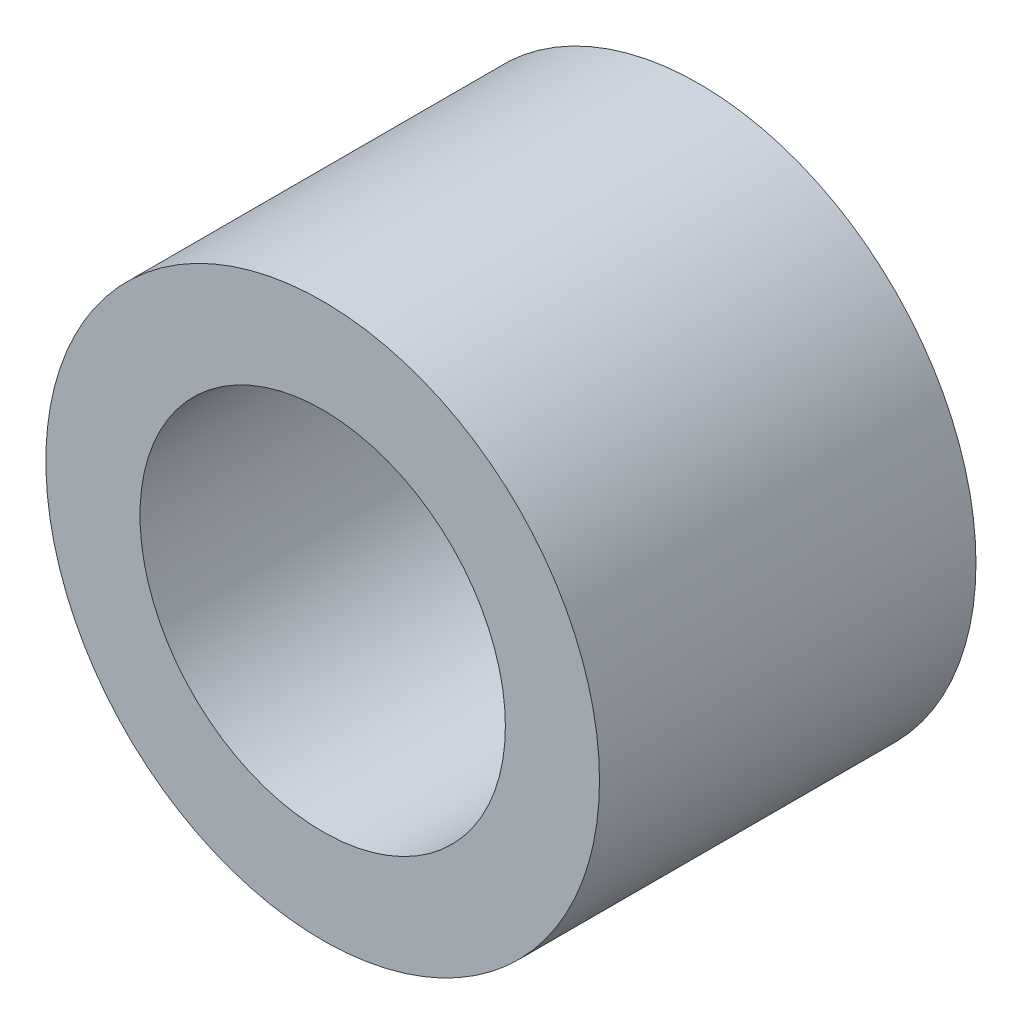
ISO-10303-21;
HEADER;
FILE_DESCRIPTION(('STEP AP214'),'2;1');
FILE_NAME('part.step','',(''),(''),'','','');
FILE_SCHEMA(('AUTOMOTIVE_DESIGN { 1 0 10303 214 1 1 1 1 }'));
ENDSEC;
DATA;
#1=APPLICATION_CONTEXT('core data for automotive mechanical design processes');
#2=APPLICATION_PROTOCOL_DEFINITION('international standard','automotive_design',2000,#1);
#3=PRODUCT_CONTEXT('',#1,'mechanical');
#4=PRODUCT('Part','Part','',(#3));
#5=PRODUCT_RELATED_PRODUCT_CATEGORY('part','',(#4));
#6=PRODUCT_DEFINITION_FORMATION('','',#4);
#7=PRODUCT_DEFINITION_CONTEXT('part definition',#1,'design');
#8=PRODUCT_DEFINITION('design','',#6,#7);
#9=PRODUCT_DEFINITION_SHAPE('','',#8);
#10=(LENGTH_UNIT() NAMED_UNIT(*) SI_UNIT(.MILLI.,.METRE.));
#11=(NAMED_UNIT(*) PLANE_ANGLE_UNIT() SI_UNIT($,.RADIAN.));
#12=(NAMED_UNIT(*) SI_UNIT($,.STERADIAN.) SOLID_ANGLE_UNIT());
#13=UNCERTAINTY_MEASURE_WITH_UNIT(LENGTH_MEASURE(1.E-05),#10,'distance_accuracy_value','');
#14=(GEOMETRIC_REPRESENTATION_CONTEXT(3) GLOBAL_UNCERTAINTY_ASSIGNED_CONTEXT((#13)) GLOBAL_UNIT_ASSIGNED_CONTEXT((#10,
#11,#12)) REPRESENTATION_CONTEXT('',''));
#15=CARTESIAN_POINT('',(0.,0.,0.));
#16=DIRECTION('',(0.,0.,1.));
#17=DIRECTION('',(1.,0.,0.));
#18=AXIS2_PLACEMENT_3D('',#15,#16,#17);
#19=CARTESIAN_POINT('',(0.,0.,8.636));
#20=DIRECTION('',(0.,0.,-1.));
#21=DIRECTION('',(-1.,0.,0.));
#22=AXIS2_PLACEMENT_3D('',#19,#20,#21);
#23=CYLINDRICAL_SURFACE('',#22,6.35);
#24=CARTESIAN_POINT('',(0.,0.,8.636));
#25=DIRECTION('',(0.,0.,1.));
#26=DIRECTION('',(1.,0.,0.));
#27=AXIS2_PLACEMENT_3D('',#24,#25,#26);
#28=CIRCLE('',#27,6.35);
#29=CARTESIAN_POINT('',(6.35,0.,8.636));
#30=VERTEX_POINT('',#29);
#31=EDGE_CURVE('E10',#30,#30,#28,.T.);
#32=ORIENTED_EDGE('',*,*,#31,.F.);
#33=EDGE_LOOP('',(#32));
#34=FACE_BOUND('',#33,.T.);
#35=CARTESIAN_POINT('',(0.,0.,0.));
#36=DIRECTION('',(0.,0.,1.));
#37=DIRECTION('',(1.,0.,0.));
#38=AXIS2_PLACEMENT_3D('',#35,#36,#37);
#39=CIRCLE('',#38,6.35);
#40=CARTESIAN_POINT('',(6.35,0.,0.));
#41=VERTEX_POINT('',#40);
#42=EDGE_CURVE('E18',#41,#41,#39,.T.);
#43=ORIENTED_EDGE('',*,*,#42,.T.);
#44=EDGE_LOOP('',(#43));
#45=FACE_BOUND('',#44,.T.);
#46=ADVANCED_FACE('F15',(#34,#45),#23,.T.);
#47=CARTESIAN_POINT('',(0.,0.,8.636));
#48=DIRECTION('',(0.,0.,1.));
#49=DIRECTION('',(1.,0.,0.));
#50=AXIS2_PLACEMENT_3D('',#47,#48,#49);
#51=PLANE('',#50);
#52=CARTESIAN_POINT('',(0.,0.,8.636));
#53=DIRECTION('',(0.,0.,1.));
#54=DIRECTION('',(1.,0.,0.));
#55=AXIS2_PLACEMENT_3D('',#52,#53,#54);
#56=CIRCLE('',#55,4.191);
#57=CARTESIAN_POINT('',(4.191,0.,8.636));
#58=VERTEX_POINT('',#57);
#59=EDGE_CURVE('E34',#58,#58,#56,.T.);
#60=ORIENTED_EDGE('',*,*,#59,.F.);
#61=EDGE_LOOP('',(#60));
#62=FACE_BOUND('',#61,.T.);
#63=ORIENTED_EDGE('',*,*,#31,.T.);
#64=EDGE_LOOP('',(#63));
#65=FACE_BOUND('',#64,.T.);
#66=ADVANCED_FACE('F40',(#62,#65),#51,.T.);
#67=CARTESIAN_POINT('',(0.,0.,0.));
#68=DIRECTION('',(0.,0.,1.));
#69=DIRECTION('',(1.,0.,0.));
#70=AXIS2_PLACEMENT_3D('',#67,#68,#69);
#71=PLANE('',#70);
#72=CARTESIAN_POINT('',(0.,0.,0.));
#73=DIRECTION('',(0.,0.,1.));
#74=DIRECTION('',(1.,0.,0.));
#75=AXIS2_PLACEMENT_3D('',#72,#73,#74);
#76=CIRCLE('',#75,4.191);
#77=CARTESIAN_POINT('',(4.191,0.,0.));
#78=VERTEX_POINT('',#77);
#79=EDGE_CURVE('E29',#78,#78,#76,.F.);
#80=ORIENTED_EDGE('',*,*,#79,.F.);
#81=EDGE_LOOP('',(#80));
#82=FACE_BOUND('',#81,.T.);
#83=ORIENTED_EDGE('',*,*,#42,.F.);
#84=EDGE_LOOP('',(#83));
#85=FACE_BOUND('',#84,.T.);
#86=ADVANCED_FACE('F42',(#82,#85),#71,.F.);
#87=CARTESIAN_POINT('',(0.,0.,-0.00200000000000027));
#88=DIRECTION('',(0.,0.,1.));
#89=DIRECTION('',(1.,0.,0.));
#90=AXIS2_PLACEMENT_3D('',#87,#88,#89);
#91=CYLINDRICAL_SURFACE('',#90,4.191);
#92=ORIENTED_EDGE('',*,*,#79,.T.);
#93=EDGE_LOOP('',(#92));
#94=FACE_BOUND('',#93,.T.);
#95=ORIENTED_EDGE('',*,*,#59,.T.);
#96=EDGE_LOOP('',(#95));
#97=FACE_BOUND('',#96,.T.);
#98=ADVANCED_FACE('F38',(#94,#97),#91,.F.);
#99=CLOSED_SHELL('',(#46,#66,#86,#98));
#100=MANIFOLD_SOLID_BREP('B1',#99);
#101=ADVANCED_BREP_SHAPE_REPRESENTATION('',(#18,#100),#14);
#102=SHAPE_DEFINITION_REPRESENTATION(#9,#101);
ENDSEC;
END-ISO-10303-21;
